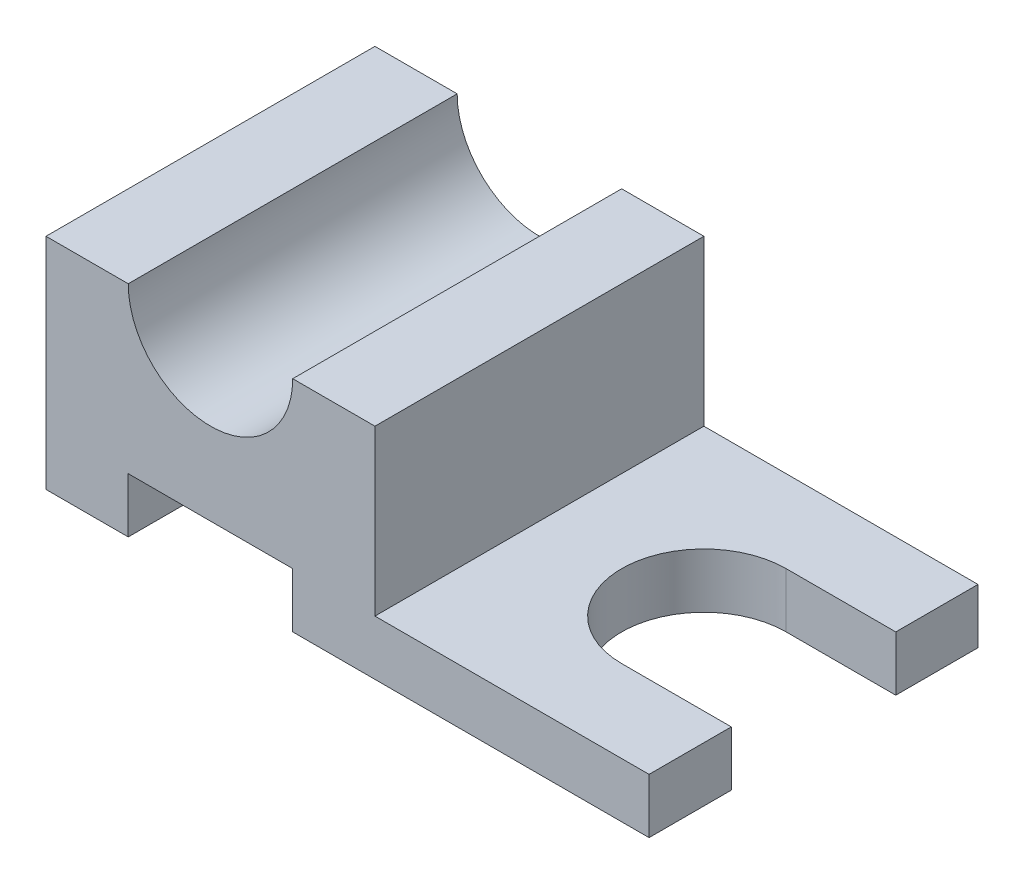
ISO-10303-21;
HEADER;
FILE_DESCRIPTION(('STEP AP214'),'2;1');
FILE_NAME('part.step','',(''),(''),'','','');
FILE_SCHEMA(('AUTOMOTIVE_DESIGN { 1 0 10303 214 1 1 1 1 }'));
ENDSEC;
DATA;
#1=APPLICATION_CONTEXT('core data for automotive mechanical design processes');
#2=APPLICATION_PROTOCOL_DEFINITION('international standard','automotive_design',2000,#1);
#3=PRODUCT_CONTEXT('',#1,'mechanical');
#4=PRODUCT('Part','Part','',(#3));
#5=PRODUCT_RELATED_PRODUCT_CATEGORY('part','',(#4));
#6=PRODUCT_DEFINITION_FORMATION('','',#4);
#7=PRODUCT_DEFINITION_CONTEXT('part definition',#1,'design');
#8=PRODUCT_DEFINITION('design','',#6,#7);
#9=PRODUCT_DEFINITION_SHAPE('','',#8);
#10=(LENGTH_UNIT() NAMED_UNIT(*) SI_UNIT(.MILLI.,.METRE.));
#11=(NAMED_UNIT(*) PLANE_ANGLE_UNIT() SI_UNIT($,.RADIAN.));
#12=(NAMED_UNIT(*) SI_UNIT($,.STERADIAN.) SOLID_ANGLE_UNIT());
#13=UNCERTAINTY_MEASURE_WITH_UNIT(LENGTH_MEASURE(1.E-05),#10,'distance_accuracy_value','');
#14=(GEOMETRIC_REPRESENTATION_CONTEXT(3) GLOBAL_UNCERTAINTY_ASSIGNED_CONTEXT((#13)) GLOBAL_UNIT_ASSIGNED_CONTEXT((#10,
#11,#12)) REPRESENTATION_CONTEXT('',''));
#15=CARTESIAN_POINT('',(0.,0.,0.));
#16=DIRECTION('',(0.,0.,1.));
#17=DIRECTION('',(1.,0.,0.));
#18=AXIS2_PLACEMENT_3D('',#15,#16,#17);
#19=CARTESIAN_POINT('',(80.,20.3267764298094,60.));
#20=DIRECTION('',(-1.,0.,0.));
#21=DIRECTION('',(0.,0.,1.));
#22=AXIS2_PLACEMENT_3D('',#19,#20,#21);
#23=PLANE('',#22);
#24=DIRECTION('',(0.,0.,-1.));
#25=VECTOR('',#24,1.);
#26=CARTESIAN_POINT('',(80.,20.3267764298094,60.));
#27=LINE('',#26,#25);
#28=CARTESIAN_POINT('',(80.,20.3267764298094,15.));
#29=VERTEX_POINT('',#28);
#30=CARTESIAN_POINT('',(80.,20.3267764298094,0.));
#31=VERTEX_POINT('',#30);
#32=EDGE_CURVE('E195',#29,#31,#27,.T.);
#33=ORIENTED_EDGE('',*,*,#32,.F.);
#34=DIRECTION('',(0.,1.,0.));
#35=VECTOR('',#34,1.);
#36=CARTESIAN_POINT('',(80.,-39.6732235701906,15.));
#37=LINE('',#36,#35);
#38=CARTESIAN_POINT('',(80.,10.3267764298094,15.));
#39=VERTEX_POINT('',#38);
#40=EDGE_CURVE('E278',#39,#29,#37,.T.);
#41=ORIENTED_EDGE('',*,*,#40,.F.);
#42=DIRECTION('',(0.,0.,-1.));
#43=VECTOR('',#42,1.);
#44=CARTESIAN_POINT('',(80.,10.3267764298094,60.));
#45=LINE('',#44,#43);
#46=CARTESIAN_POINT('',(80.,10.3267764298094,0.));
#47=VERTEX_POINT('',#46);
#48=EDGE_CURVE('E199',#39,#47,#45,.T.);
#49=ORIENTED_EDGE('',*,*,#48,.T.);
#50=DIRECTION('',(0.,1.,0.));
#51=VECTOR('',#50,1.);
#52=CARTESIAN_POINT('',(80.,20.3267764298094,0.));
#53=LINE('',#52,#51);
#54=EDGE_CURVE('E182',#47,#31,#53,.T.);
#55=ORIENTED_EDGE('',*,*,#54,.T.);
#56=EDGE_LOOP('',(#33,#41,#49,#55));
#57=FACE_BOUND('',#56,.T.);
#58=ADVANCED_FACE('F33',(#57),#23,.F.);
#59=CARTESIAN_POINT('',(-15.,50.3267764298094,60.));
#60=DIRECTION('',(0.,-1.,0.));
#61=DIRECTION('',(0.,0.,-1.));
#62=AXIS2_PLACEMENT_3D('',#59,#60,#61);
#63=PLANE('',#62);
#64=DIRECTION('',(-1.,0.,0.));
#65=VECTOR('',#64,1.);
#66=CARTESIAN_POINT('',(-15.,50.3267764298094,0.));
#67=LINE('',#66,#65);
#68=CARTESIAN_POINT('',(-15.,50.3267764298094,0.));
#69=VERTEX_POINT('',#68);
#70=CARTESIAN_POINT('',(-30.,50.3267764298094,0.));
#71=VERTEX_POINT('',#70);
#72=EDGE_CURVE('E165',#69,#71,#67,.T.);
#73=ORIENTED_EDGE('',*,*,#72,.T.);
#74=DIRECTION('',(0.,0.,-1.));
#75=VECTOR('',#74,1.);
#76=CARTESIAN_POINT('',(-30.,50.3267764298094,60.));
#77=LINE('',#76,#75);
#78=CARTESIAN_POINT('',(-30.,50.3267764298094,60.));
#79=VERTEX_POINT('',#78);
#80=EDGE_CURVE('E11',#79,#71,#77,.T.);
#81=ORIENTED_EDGE('',*,*,#80,.F.);
#82=DIRECTION('',(-1.,0.,0.));
#83=VECTOR('',#82,1.);
#84=CARTESIAN_POINT('',(-15.,50.3267764298094,60.));
#85=LINE('',#84,#83);
#86=CARTESIAN_POINT('',(-15.,50.3267764298094,60.));
#87=VERTEX_POINT('',#86);
#88=EDGE_CURVE('E191',#87,#79,#85,.T.);
#89=ORIENTED_EDGE('',*,*,#88,.F.);
#90=DIRECTION('',(0.,0.,-1.));
#91=VECTOR('',#90,1.);
#92=CARTESIAN_POINT('',(-15.,50.3267764298094,60.));
#93=LINE('',#92,#91);
#94=EDGE_CURVE('E161',#87,#69,#93,.T.);
#95=ORIENTED_EDGE('',*,*,#94,.T.);
#96=EDGE_LOOP('',(#73,#81,#89,#95));
#97=FACE_BOUND('',#96,.T.);
#98=ADVANCED_FACE('F35',(#97),#63,.F.);
#99=CARTESIAN_POINT('',(-30.,50.3267764298094,60.));
#100=DIRECTION('',(1.,0.,0.));
#101=DIRECTION('',(0.,0.,-1.));
#102=AXIS2_PLACEMENT_3D('',#99,#100,#101);
#103=PLANE('',#102);
#104=DIRECTION('',(0.,-1.,0.));
#105=VECTOR('',#104,1.);
#106=CARTESIAN_POINT('',(-30.,50.3267764298094,0.));
#107=LINE('',#106,#105);
#108=CARTESIAN_POINT('',(-30.,10.3267764298094,0.));
#109=VERTEX_POINT('',#108);
#110=EDGE_CURVE('E168',#71,#109,#107,.T.);
#111=ORIENTED_EDGE('',*,*,#110,.T.);
#112=DIRECTION('',(0.,0.,-1.));
#113=VECTOR('',#112,1.);
#114=CARTESIAN_POINT('',(-30.,10.3267764298094,60.));
#115=LINE('',#114,#113);
#116=CARTESIAN_POINT('',(-30.,10.3267764298094,60.));
#117=VERTEX_POINT('',#116);
#118=EDGE_CURVE('E41',#117,#109,#115,.T.);
#119=ORIENTED_EDGE('',*,*,#118,.F.);
#120=DIRECTION('',(0.,-1.,0.));
#121=VECTOR('',#120,1.);
#122=CARTESIAN_POINT('',(-30.,50.3267764298094,60.));
#123=LINE('',#122,#121);
#124=EDGE_CURVE('E110',#79,#117,#123,.T.);
#125=ORIENTED_EDGE('',*,*,#124,.F.);
#126=ORIENTED_EDGE('',*,*,#80,.T.);
#127=EDGE_LOOP('',(#111,#119,#125,#126));
#128=FACE_BOUND('',#127,.T.);
#129=ADVANCED_FACE('F334',(#128),#103,.F.);
#130=CARTESIAN_POINT('',(-30.,10.3267764298094,60.));
#131=DIRECTION('',(0.,1.,0.));
#132=DIRECTION('',(0.,0.,1.));
#133=AXIS2_PLACEMENT_3D('',#130,#131,#132);
#134=PLANE('',#133);
#135=DIRECTION('',(1.,0.,0.));
#136=VECTOR('',#135,1.);
#137=CARTESIAN_POINT('',(-30.,10.3267764298094,0.));
#138=LINE('',#137,#136);
#139=CARTESIAN_POINT('',(-15.,10.3267764298094,0.));
#140=VERTEX_POINT('',#139);
#141=EDGE_CURVE('E171',#109,#140,#138,.T.);
#142=ORIENTED_EDGE('',*,*,#141,.T.);
#143=DIRECTION('',(0.,0.,-1.));
#144=VECTOR('',#143,1.);
#145=CARTESIAN_POINT('',(-15.,10.3267764298094,60.));
#146=LINE('',#145,#144);
#147=CARTESIAN_POINT('',(-15.,10.3267764298094,60.));
#148=VERTEX_POINT('',#147);
#149=EDGE_CURVE('E212',#148,#140,#146,.T.);
#150=ORIENTED_EDGE('',*,*,#149,.F.);
#151=DIRECTION('',(1.,0.,0.));
#152=VECTOR('',#151,1.);
#153=CARTESIAN_POINT('',(-30.,10.3267764298094,60.));
#154=LINE('',#153,#152);
#155=EDGE_CURVE('E220',#117,#148,#154,.T.);
#156=ORIENTED_EDGE('',*,*,#155,.F.);
#157=ORIENTED_EDGE('',*,*,#118,.T.);
#158=EDGE_LOOP('',(#142,#150,#156,#157));
#159=FACE_BOUND('',#158,.T.);
#160=ADVANCED_FACE('F218',(#159),#134,.F.);
#161=CARTESIAN_POINT('',(-15.,10.3267764298094,60.));
#162=DIRECTION('',(-1.,0.,0.));
#163=DIRECTION('',(0.,0.,1.));
#164=AXIS2_PLACEMENT_3D('',#161,#162,#163);
#165=PLANE('',#164);
#166=DIRECTION('',(0.,1.,0.));
#167=VECTOR('',#166,1.);
#168=CARTESIAN_POINT('',(-15.,10.3267764298094,0.));
#169=LINE('',#168,#167);
#170=CARTESIAN_POINT('',(-15.,20.3267764298094,0.));
#171=VERTEX_POINT('',#170);
#172=EDGE_CURVE('E173',#140,#171,#169,.T.);
#173=ORIENTED_EDGE('',*,*,#172,.T.);
#174=DIRECTION('',(0.,0.,-1.));
#175=VECTOR('',#174,1.);
#176=CARTESIAN_POINT('',(-15.,20.3267764298094,60.));
#177=LINE('',#176,#175);
#178=CARTESIAN_POINT('',(-15.,20.3267764298094,60.));
#179=VERTEX_POINT('',#178);
#180=EDGE_CURVE('E209',#179,#171,#177,.T.);
#181=ORIENTED_EDGE('',*,*,#180,.F.);
#182=DIRECTION('',(0.,1.,0.));
#183=VECTOR('',#182,1.);
#184=CARTESIAN_POINT('',(-15.,10.3267764298094,60.));
#185=LINE('',#184,#183);
#186=EDGE_CURVE('E238',#148,#179,#185,.T.);
#187=ORIENTED_EDGE('',*,*,#186,.F.);
#188=ORIENTED_EDGE('',*,*,#149,.T.);
#189=EDGE_LOOP('',(#173,#181,#187,#188));
#190=FACE_BOUND('',#189,.T.);
#191=ADVANCED_FACE('F229',(#190),#165,.F.);
#192=CARTESIAN_POINT('',(-15.,20.3267764298094,60.));
#193=DIRECTION('',(0.,1.,0.));
#194=DIRECTION('',(0.,0.,1.));
#195=AXIS2_PLACEMENT_3D('',#192,#193,#194);
#196=PLANE('',#195);
#197=DIRECTION('',(1.,0.,0.));
#198=VECTOR('',#197,1.);
#199=CARTESIAN_POINT('',(-15.,20.3267764298094,0.));
#200=LINE('',#199,#198);
#201=CARTESIAN_POINT('',(15.,20.3267764298094,0.));
#202=VERTEX_POINT('',#201);
#203=EDGE_CURVE('E175',#171,#202,#200,.T.);
#204=ORIENTED_EDGE('',*,*,#203,.T.);
#205=DIRECTION('',(0.,0.,-1.));
#206=VECTOR('',#205,1.);
#207=CARTESIAN_POINT('',(15.,20.3267764298094,60.));
#208=LINE('',#207,#206);
#209=CARTESIAN_POINT('',(15.,20.3267764298094,60.));
#210=VERTEX_POINT('',#209);
#211=EDGE_CURVE('E206',#210,#202,#208,.T.);
#212=ORIENTED_EDGE('',*,*,#211,.F.);
#213=DIRECTION('',(1.,0.,0.));
#214=VECTOR('',#213,1.);
#215=CARTESIAN_POINT('',(-15.,20.3267764298094,60.));
#216=LINE('',#215,#214);
#217=EDGE_CURVE('E235',#179,#210,#216,.T.);
#218=ORIENTED_EDGE('',*,*,#217,.F.);
#219=ORIENTED_EDGE('',*,*,#180,.T.);
#220=EDGE_LOOP('',(#204,#212,#218,#219));
#221=FACE_BOUND('',#220,.T.);
#222=ADVANCED_FACE('F233',(#221),#196,.F.);
#223=CARTESIAN_POINT('',(15.,10.3267764298094,60.));
#224=DIRECTION('',(1.,0.,0.));
#225=DIRECTION('',(0.,0.,-1.));
#226=AXIS2_PLACEMENT_3D('',#223,#224,#225);
#227=PLANE('',#226);
#228=DIRECTION('',(0.,-1.,0.));
#229=VECTOR('',#228,1.);
#230=CARTESIAN_POINT('',(15.,10.3267764298094,0.));
#231=LINE('',#230,#229);
#232=CARTESIAN_POINT('',(15.,10.3267764298094,0.));
#233=VERTEX_POINT('',#232);
#234=EDGE_CURVE('E177',#202,#233,#231,.T.);
#235=ORIENTED_EDGE('',*,*,#234,.T.);
#236=DIRECTION('',(0.,0.,-1.));
#237=VECTOR('',#236,1.);
#238=CARTESIAN_POINT('',(15.,10.3267764298094,60.));
#239=LINE('',#238,#237);
#240=CARTESIAN_POINT('',(15.,10.3267764298094,60.));
#241=VERTEX_POINT('',#240);
#242=EDGE_CURVE('E203',#241,#233,#239,.T.);
#243=ORIENTED_EDGE('',*,*,#242,.F.);
#244=DIRECTION('',(0.,-1.,0.));
#245=VECTOR('',#244,1.);
#246=CARTESIAN_POINT('',(15.,10.3267764298094,60.));
#247=LINE('',#246,#245);
#248=EDGE_CURVE('E237',#210,#241,#247,.T.);
#249=ORIENTED_EDGE('',*,*,#248,.F.);
#250=ORIENTED_EDGE('',*,*,#211,.T.);
#251=EDGE_LOOP('',(#235,#243,#249,#250));
#252=FACE_BOUND('',#251,.T.);
#253=ADVANCED_FACE('F320',(#252),#227,.F.);
#254=CARTESIAN_POINT('',(15.,10.3267764298094,60.));
#255=DIRECTION('',(0.,1.,0.));
#256=DIRECTION('',(0.,0.,1.));
#257=AXIS2_PLACEMENT_3D('',#254,#255,#256);
#258=PLANE('',#257);
#259=ORIENTED_EDGE('',*,*,#48,.F.);
#260=DIRECTION('',(-1.,0.,0.));
#261=VECTOR('',#260,1.);
#262=CARTESIAN_POINT('',(15.,10.3267764298094,15.));
#263=LINE('',#262,#261);
#264=CARTESIAN_POINT('',(60.,10.3267764298094,15.));
#265=VERTEX_POINT('',#264);
#266=EDGE_CURVE('E169',#39,#265,#263,.T.);
#267=ORIENTED_EDGE('',*,*,#266,.T.);
#268=CARTESIAN_POINT('',(60.,10.3267764298094,30.));
#269=DIRECTION('',(0.,1.,0.));
#270=DIRECTION('',(0.,0.,1.));
#271=AXIS2_PLACEMENT_3D('',#268,#269,#270);
#272=CIRCLE('',#271,15.);
#273=CARTESIAN_POINT('',(60.,10.3267764298094,45.));
#274=VERTEX_POINT('',#273);
#275=EDGE_CURVE('E275',#265,#274,#272,.T.);
#276=ORIENTED_EDGE('',*,*,#275,.T.);
#277=DIRECTION('',(1.,0.,0.));
#278=VECTOR('',#277,1.);
#279=CARTESIAN_POINT('',(15.,10.3267764298094,45.));
#280=LINE('',#279,#278);
#281=CARTESIAN_POINT('',(80.,10.3267764298094,45.));
#282=VERTEX_POINT('',#281);
#283=EDGE_CURVE('E272',#274,#282,#280,.T.);
#284=ORIENTED_EDGE('',*,*,#283,.T.);
#285=CARTESIAN_POINT('',(80.,10.3267764298094,60.));
#286=VERTEX_POINT('',#285);
#287=EDGE_CURVE('E200',#286,#282,#45,.T.);
#288=ORIENTED_EDGE('',*,*,#287,.F.);
#289=DIRECTION('',(1.,0.,0.));
#290=VECTOR('',#289,1.);
#291=CARTESIAN_POINT('',(15.,10.3267764298094,60.));
#292=LINE('',#291,#290);
#293=EDGE_CURVE('E240',#241,#286,#292,.T.);
#294=ORIENTED_EDGE('',*,*,#293,.F.);
#295=ORIENTED_EDGE('',*,*,#242,.T.);
#296=DIRECTION('',(1.,0.,0.));
#297=VECTOR('',#296,1.);
#298=CARTESIAN_POINT('',(15.,10.3267764298094,0.));
#299=LINE('',#298,#297);
#300=EDGE_CURVE('E179',#233,#47,#299,.T.);
#301=ORIENTED_EDGE('',*,*,#300,.T.);
#302=EDGE_LOOP('',(#259,#267,#276,#284,#288,#294,#295,#301));
#303=FACE_BOUND('',#302,.T.);
#304=ADVANCED_FACE('F316',(#303),#258,.F.);
#305=ORIENTED_EDGE('',*,*,#287,.T.);
#306=DIRECTION('',(0.,1.,0.));
#307=VECTOR('',#306,1.);
#308=CARTESIAN_POINT('',(80.,-39.6732235701906,45.));
#309=LINE('',#308,#307);
#310=CARTESIAN_POINT('',(80.,20.3267764298094,45.));
#311=VERTEX_POINT('',#310);
#312=EDGE_CURVE('E256',#282,#311,#309,.T.);
#313=ORIENTED_EDGE('',*,*,#312,.T.);
#314=CARTESIAN_POINT('',(80.,20.3267764298094,60.));
#315=VERTEX_POINT('',#314);
#316=EDGE_CURVE('E196',#315,#311,#27,.T.);
#317=ORIENTED_EDGE('',*,*,#316,.F.);
#318=DIRECTION('',(0.,1.,0.));
#319=VECTOR('',#318,1.);
#320=CARTESIAN_POINT('',(80.,20.3267764298094,60.));
#321=LINE('',#320,#319);
#322=EDGE_CURVE('E246',#286,#315,#321,.T.);
#323=ORIENTED_EDGE('',*,*,#322,.F.);
#324=EDGE_LOOP('',(#305,#313,#317,#323));
#325=FACE_BOUND('',#324,.T.);
#326=ADVANCED_FACE('F253',(#325),#23,.F.);
#327=CARTESIAN_POINT('',(30.,20.3267764298094,60.));
#328=DIRECTION('',(0.,-1.,0.));
#329=DIRECTION('',(0.,0.,-1.));
#330=AXIS2_PLACEMENT_3D('',#327,#328,#329);
#331=PLANE('',#330);
#332=CARTESIAN_POINT('',(60.,20.3267764298094,30.));
#333=DIRECTION('',(0.,1.,0.));
#334=DIRECTION('',(0.,0.,1.));
#335=AXIS2_PLACEMENT_3D('',#332,#333,#334);
#336=CIRCLE('',#335,15.);
#337=CARTESIAN_POINT('',(60.,20.3267764298094,15.));
#338=VERTEX_POINT('',#337);
#339=CARTESIAN_POINT('',(60.,20.3267764298094,45.));
#340=VERTEX_POINT('',#339);
#341=EDGE_CURVE('E289',#338,#340,#336,.T.);
#342=ORIENTED_EDGE('',*,*,#341,.F.);
#343=DIRECTION('',(-1.,0.,0.));
#344=VECTOR('',#343,1.);
#345=CARTESIAN_POINT('',(80.,20.3267764298094,15.));
#346=LINE('',#345,#344);
#347=EDGE_CURVE('E48',#29,#338,#346,.T.);
#348=ORIENTED_EDGE('',*,*,#347,.F.);
#349=ORIENTED_EDGE('',*,*,#32,.T.);
#350=DIRECTION('',(-1.,0.,0.));
#351=VECTOR('',#350,1.);
#352=CARTESIAN_POINT('',(30.,20.3267764298094,0.));
#353=LINE('',#352,#351);
#354=CARTESIAN_POINT('',(30.,20.3267764298094,0.));
#355=VERTEX_POINT('',#354);
#356=EDGE_CURVE('E185',#31,#355,#353,.T.);
#357=ORIENTED_EDGE('',*,*,#356,.T.);
#358=DIRECTION('',(0.,0.,-1.));
#359=VECTOR('',#358,1.);
#360=CARTESIAN_POINT('',(30.,20.3267764298094,60.));
#361=LINE('',#360,#359);
#362=CARTESIAN_POINT('',(30.,20.3267764298094,60.));
#363=VERTEX_POINT('',#362);
#364=EDGE_CURVE('E156',#363,#355,#361,.T.);
#365=ORIENTED_EDGE('',*,*,#364,.F.);
#366=DIRECTION('',(-1.,0.,0.));
#367=VECTOR('',#366,1.);
#368=CARTESIAN_POINT('',(30.,20.3267764298094,60.));
#369=LINE('',#368,#367);
#370=EDGE_CURVE('E144',#315,#363,#369,.T.);
#371=ORIENTED_EDGE('',*,*,#370,.F.);
#372=ORIENTED_EDGE('',*,*,#316,.T.);
#373=DIRECTION('',(1.,0.,0.));
#374=VECTOR('',#373,1.);
#375=CARTESIAN_POINT('',(60.,20.3267764298094,45.));
#376=LINE('',#375,#374);
#377=EDGE_CURVE('E282',#340,#311,#376,.T.);
#378=ORIENTED_EDGE('',*,*,#377,.F.);
#379=EDGE_LOOP('',(#342,#348,#349,#357,#365,#371,#372,#378));
#380=FACE_BOUND('',#379,.T.);
#381=ADVANCED_FACE('F260',(#380),#331,.F.);
#382=CARTESIAN_POINT('',(30.,50.3267764298094,60.));
#383=DIRECTION('',(-1.,0.,0.));
#384=DIRECTION('',(0.,-1.,0.));
#385=AXIS2_PLACEMENT_3D('',#382,#383,#384);
#386=PLANE('',#385);
#387=DIRECTION('',(0.,1.,0.));
#388=VECTOR('',#387,1.);
#389=CARTESIAN_POINT('',(30.,50.3267764298094,0.));
#390=LINE('',#389,#388);
#391=CARTESIAN_POINT('',(30.,50.3267764298094,0.));
#392=VERTEX_POINT('',#391);
#393=EDGE_CURVE('E153',#355,#392,#390,.T.);
#394=ORIENTED_EDGE('',*,*,#393,.T.);
#395=DIRECTION('',(0.,0.,-1.));
#396=VECTOR('',#395,1.);
#397=CARTESIAN_POINT('',(30.,50.3267764298094,60.));
#398=LINE('',#397,#396);
#399=CARTESIAN_POINT('',(30.,50.3267764298094,60.));
#400=VERTEX_POINT('',#399);
#401=EDGE_CURVE('E150',#400,#392,#398,.T.);
#402=ORIENTED_EDGE('',*,*,#401,.F.);
#403=DIRECTION('',(0.,1.,0.));
#404=VECTOR('',#403,1.);
#405=CARTESIAN_POINT('',(30.,50.3267764298094,60.));
#406=LINE('',#405,#404);
#407=EDGE_CURVE('E137',#363,#400,#406,.T.);
#408=ORIENTED_EDGE('',*,*,#407,.F.);
#409=ORIENTED_EDGE('',*,*,#364,.T.);
#410=EDGE_LOOP('',(#394,#402,#408,#409));
#411=FACE_BOUND('',#410,.T.);
#412=ADVANCED_FACE('F151',(#411),#386,.F.);
#413=CARTESIAN_POINT('',(15.,50.3267764298094,60.));
#414=DIRECTION('',(0.,-1.,0.));
#415=DIRECTION('',(0.,0.,-1.));
#416=AXIS2_PLACEMENT_3D('',#413,#414,#415);
#417=PLANE('',#416);
#418=DIRECTION('',(-1.,0.,0.));
#419=VECTOR('',#418,1.);
#420=CARTESIAN_POINT('',(15.,50.3267764298094,0.));
#421=LINE('',#420,#419);
#422=CARTESIAN_POINT('',(15.,50.3267764298094,0.));
#423=VERTEX_POINT('',#422);
#424=EDGE_CURVE('E188',#392,#423,#421,.T.);
#425=ORIENTED_EDGE('',*,*,#424,.T.);
#426=DIRECTION('',(0.,0.,-1.));
#427=VECTOR('',#426,1.);
#428=CARTESIAN_POINT('',(15.,50.3267764298094,60.));
#429=LINE('',#428,#427);
#430=CARTESIAN_POINT('',(15.,50.3267764298094,60.));
#431=VERTEX_POINT('',#430);
#432=EDGE_CURVE('E157',#431,#423,#429,.T.);
#433=ORIENTED_EDGE('',*,*,#432,.F.);
#434=DIRECTION('',(-1.,0.,0.));
#435=VECTOR('',#434,1.);
#436=CARTESIAN_POINT('',(15.,50.3267764298094,60.));
#437=LINE('',#436,#435);
#438=EDGE_CURVE('E141',#400,#431,#437,.T.);
#439=ORIENTED_EDGE('',*,*,#438,.F.);
#440=ORIENTED_EDGE('',*,*,#401,.T.);
#441=EDGE_LOOP('',(#425,#433,#439,#440));
#442=FACE_BOUND('',#441,.T.);
#443=ADVANCED_FACE('F159',(#442),#417,.F.);
#444=CARTESIAN_POINT('',(0.,50.3267764298094,60.));
#445=DIRECTION('',(0.,0.,-1.));
#446=DIRECTION('',(-1.,0.,0.));
#447=AXIS2_PLACEMENT_3D('',#444,#445,#446);
#448=CYLINDRICAL_SURFACE('',#447,15.);
#449=CARTESIAN_POINT('',(0.,50.3267764298094,0.));
#450=DIRECTION('',(0.,0.,-1.));
#451=DIRECTION('',(1.,0.,0.));
#452=AXIS2_PLACEMENT_3D('',#449,#450,#451);
#453=CIRCLE('',#452,15.);
#454=EDGE_CURVE('E102',#423,#69,#453,.T.);
#455=ORIENTED_EDGE('',*,*,#454,.T.);
#456=ORIENTED_EDGE('',*,*,#94,.F.);
#457=CARTESIAN_POINT('',(0.,50.3267764298094,60.));
#458=DIRECTION('',(0.,0.,-1.));
#459=DIRECTION('',(1.,0.,0.));
#460=AXIS2_PLACEMENT_3D('',#457,#458,#459);
#461=CIRCLE('',#460,15.);
#462=EDGE_CURVE('E57',#431,#87,#461,.T.);
#463=ORIENTED_EDGE('',*,*,#462,.F.);
#464=ORIENTED_EDGE('',*,*,#432,.T.);
#465=EDGE_LOOP('',(#455,#456,#463,#464));
#466=FACE_BOUND('',#465,.T.);
#467=ADVANCED_FACE('F263',(#466),#448,.F.);
#468=CARTESIAN_POINT('',(0.,50.3267764298094,60.));
#469=DIRECTION('',(0.,0.,1.));
#470=DIRECTION('',(1.,0.,0.));
#471=AXIS2_PLACEMENT_3D('',#468,#469,#470);
#472=PLANE('',#471);
#473=ORIENTED_EDGE('',*,*,#88,.T.);
#474=ORIENTED_EDGE('',*,*,#124,.T.);
#475=ORIENTED_EDGE('',*,*,#155,.T.);
#476=ORIENTED_EDGE('',*,*,#186,.T.);
#477=ORIENTED_EDGE('',*,*,#217,.T.);
#478=ORIENTED_EDGE('',*,*,#248,.T.);
#479=ORIENTED_EDGE('',*,*,#293,.T.);
#480=ORIENTED_EDGE('',*,*,#322,.T.);
#481=ORIENTED_EDGE('',*,*,#370,.T.);
#482=ORIENTED_EDGE('',*,*,#407,.T.);
#483=ORIENTED_EDGE('',*,*,#438,.T.);
#484=ORIENTED_EDGE('',*,*,#462,.T.);
#485=EDGE_LOOP('',(#473,#474,#475,#476,#477,#478,#479,#480,#481,#482,#483,#484));
#486=FACE_BOUND('',#485,.T.);
#487=ADVANCED_FACE('F139',(#486),#472,.T.);
#488=CARTESIAN_POINT('',(0.,50.3267764298094,0.));
#489=DIRECTION('',(0.,0.,1.));
#490=DIRECTION('',(1.,0.,0.));
#491=AXIS2_PLACEMENT_3D('',#488,#489,#490);
#492=PLANE('',#491);
#493=ORIENTED_EDGE('',*,*,#72,.F.);
#494=ORIENTED_EDGE('',*,*,#454,.F.);
#495=ORIENTED_EDGE('',*,*,#424,.F.);
#496=ORIENTED_EDGE('',*,*,#393,.F.);
#497=ORIENTED_EDGE('',*,*,#356,.F.);
#498=ORIENTED_EDGE('',*,*,#54,.F.);
#499=ORIENTED_EDGE('',*,*,#300,.F.);
#500=ORIENTED_EDGE('',*,*,#234,.F.);
#501=ORIENTED_EDGE('',*,*,#203,.F.);
#502=ORIENTED_EDGE('',*,*,#172,.F.);
#503=ORIENTED_EDGE('',*,*,#141,.F.);
#504=ORIENTED_EDGE('',*,*,#110,.F.);
#505=EDGE_LOOP('',(#493,#494,#495,#496,#497,#498,#499,#500,#501,#502,#503,#504));
#506=FACE_BOUND('',#505,.T.);
#507=ADVANCED_FACE('F224',(#506),#492,.F.);
#508=CARTESIAN_POINT('',(80.,-39.6732235701906,15.));
#509=DIRECTION('',(0.,0.,-1.));
#510=DIRECTION('',(-1.,0.,0.));
#511=AXIS2_PLACEMENT_3D('',#508,#509,#510);
#512=PLANE('',#511);
#513=ORIENTED_EDGE('',*,*,#40,.T.);
#514=ORIENTED_EDGE('',*,*,#347,.T.);
#515=DIRECTION('',(0.,1.,0.));
#516=VECTOR('',#515,1.);
#517=CARTESIAN_POINT('',(60.,-39.6732235701906,15.));
#518=LINE('',#517,#516);
#519=EDGE_CURVE('E279',#265,#338,#518,.T.);
#520=ORIENTED_EDGE('',*,*,#519,.F.);
#521=ORIENTED_EDGE('',*,*,#266,.F.);
#522=EDGE_LOOP('',(#513,#514,#520,#521));
#523=FACE_BOUND('',#522,.T.);
#524=ADVANCED_FACE('F311',(#523),#512,.F.);
#525=CARTESIAN_POINT('',(60.,-39.6732235701906,45.));
#526=DIRECTION('',(0.,0.,1.));
#527=DIRECTION('',(1.,0.,0.));
#528=AXIS2_PLACEMENT_3D('',#525,#526,#527);
#529=PLANE('',#528);
#530=DIRECTION('',(0.,1.,0.));
#531=VECTOR('',#530,1.);
#532=CARTESIAN_POINT('',(60.,-39.6732235701906,45.));
#533=LINE('',#532,#531);
#534=EDGE_CURVE('E281',#274,#340,#533,.T.);
#535=ORIENTED_EDGE('',*,*,#534,.T.);
#536=ORIENTED_EDGE('',*,*,#377,.T.);
#537=ORIENTED_EDGE('',*,*,#312,.F.);
#538=ORIENTED_EDGE('',*,*,#283,.F.);
#539=EDGE_LOOP('',(#535,#536,#537,#538));
#540=FACE_BOUND('',#539,.T.);
#541=ADVANCED_FACE('F300',(#540),#529,.F.);
#542=CARTESIAN_POINT('',(60.,-39.6732235701906,30.));
#543=DIRECTION('',(0.,1.,0.));
#544=DIRECTION('',(0.,0.,1.));
#545=AXIS2_PLACEMENT_3D('',#542,#543,#544);
#546=CYLINDRICAL_SURFACE('',#545,15.);
#547=ORIENTED_EDGE('',*,*,#519,.T.);
#548=ORIENTED_EDGE('',*,*,#341,.T.);
#549=ORIENTED_EDGE('',*,*,#534,.F.);
#550=ORIENTED_EDGE('',*,*,#275,.F.);
#551=EDGE_LOOP('',(#547,#548,#549,#550));
#552=FACE_BOUND('',#551,.T.);
#553=ADVANCED_FACE('F295',(#552),#546,.F.);
#554=CLOSED_SHELL('',(#58,#98,#129,#160,#191,#222,#253,#304,#326,#381,#412,#443,#467,#487,#507,
#524,#541,#553));
#555=MANIFOLD_SOLID_BREP('B2',#554);
#556=ADVANCED_BREP_SHAPE_REPRESENTATION('',(#18,#555),#14);
#557=SHAPE_DEFINITION_REPRESENTATION(#9,#556);
ENDSEC;
END-ISO-10303-21;
